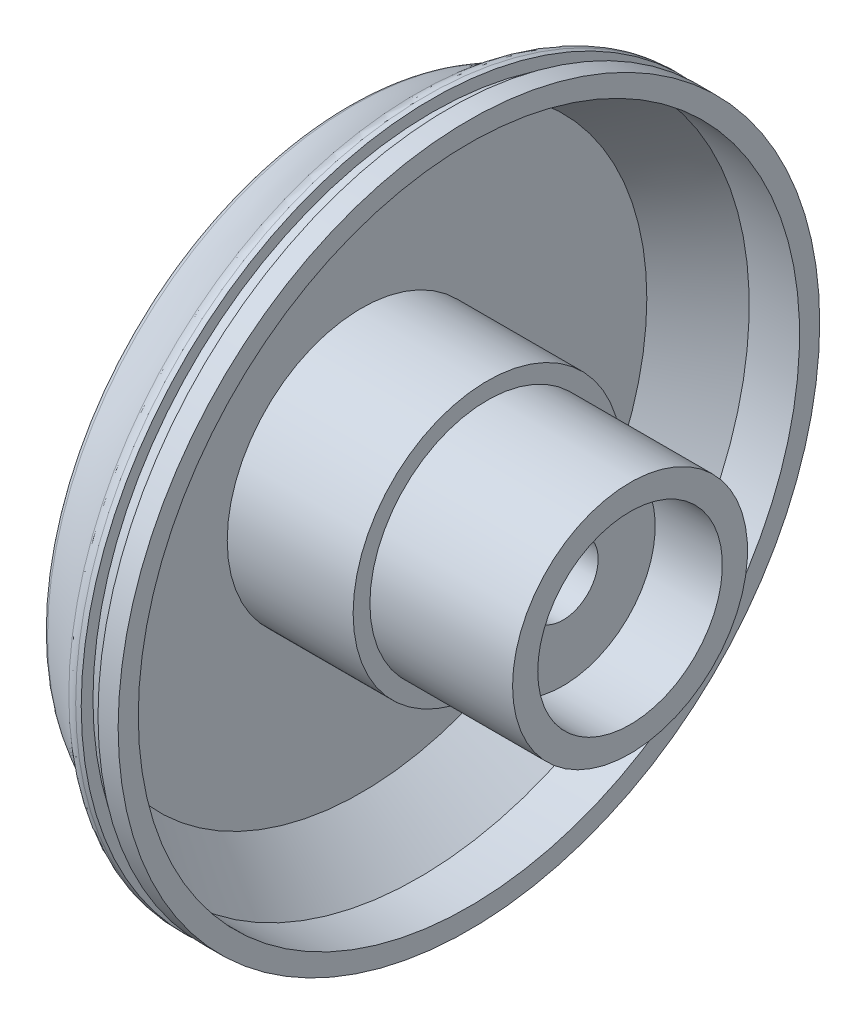
ISO-10303-21;
HEADER;
FILE_DESCRIPTION(('STEP AP214'),'2;1');
FILE_NAME('part.step','',(''),(''),'','','');
FILE_SCHEMA(('AUTOMOTIVE_DESIGN { 1 0 10303 214 1 1 1 1 }'));
ENDSEC;
DATA;
#1=APPLICATION_CONTEXT('core data for automotive mechanical design processes');
#2=APPLICATION_PROTOCOL_DEFINITION('international standard','automotive_design',2000,#1);
#3=PRODUCT_CONTEXT('',#1,'mechanical');
#4=PRODUCT('Part','Part','',(#3));
#5=PRODUCT_RELATED_PRODUCT_CATEGORY('part','',(#4));
#6=PRODUCT_DEFINITION_FORMATION('','',#4);
#7=PRODUCT_DEFINITION_CONTEXT('part definition',#1,'design');
#8=PRODUCT_DEFINITION('design','',#6,#7);
#9=PRODUCT_DEFINITION_SHAPE('','',#8);
#10=(LENGTH_UNIT() NAMED_UNIT(*) SI_UNIT(.MILLI.,.METRE.));
#11=(NAMED_UNIT(*) PLANE_ANGLE_UNIT() SI_UNIT($,.RADIAN.));
#12=(NAMED_UNIT(*) SI_UNIT($,.STERADIAN.) SOLID_ANGLE_UNIT());
#13=UNCERTAINTY_MEASURE_WITH_UNIT(LENGTH_MEASURE(1.E-05),#10,'distance_accuracy_value','');
#14=(GEOMETRIC_REPRESENTATION_CONTEXT(3) GLOBAL_UNCERTAINTY_ASSIGNED_CONTEXT((#13)) GLOBAL_UNIT_ASSIGNED_CONTEXT((#10,
#11,#12)) REPRESENTATION_CONTEXT('',''));
#15=CARTESIAN_POINT('',(0.,0.,0.));
#16=DIRECTION('',(0.,0.,1.));
#17=DIRECTION('',(1.,0.,0.));
#18=AXIS2_PLACEMENT_3D('',#15,#16,#17);
#19=CARTESIAN_POINT('',(170.,70.,0.));
#20=DIRECTION('',(-1.,0.,0.));
#21=DIRECTION('',(0.,0.,1.));
#22=AXIS2_PLACEMENT_3D('',#19,#20,#21);
#23=PLANE('',#22);
#24=CARTESIAN_POINT('',(170.,0.,0.));
#25=DIRECTION('',(-1.,0.,0.));
#26=DIRECTION('',(0.,0.,1.));
#27=AXIS2_PLACEMENT_3D('',#24,#25,#26);
#28=CIRCLE('',#27,70.);
#29=CARTESIAN_POINT('',(170.,0.,70.));
#30=VERTEX_POINT('',#29);
#31=EDGE_CURVE('E51',#30,#30,#28,.T.);
#32=ORIENTED_EDGE('',*,*,#31,.F.);
#33=EDGE_LOOP('',(#32));
#34=FACE_BOUND('',#33,.T.);
#35=CARTESIAN_POINT('',(170.,0.,0.));
#36=DIRECTION('',(-1.,0.,0.));
#37=DIRECTION('',(0.,0.,1.));
#38=AXIS2_PLACEMENT_3D('',#35,#36,#37);
#39=CIRCLE('',#38,55.);
#40=CARTESIAN_POINT('',(170.,0.,55.));
#41=VERTEX_POINT('',#40);
#42=EDGE_CURVE('E102',#41,#41,#39,.T.);
#43=ORIENTED_EDGE('',*,*,#42,.T.);
#44=EDGE_LOOP('',(#43));
#45=FACE_BOUND('',#44,.T.);
#46=ADVANCED_FACE('F31',(#34,#45),#23,.F.);
#47=CARTESIAN_POINT('',(0.,0.,0.));
#48=DIRECTION('',(-1.,0.,0.));
#49=DIRECTION('',(0.,0.,1.));
#50=AXIS2_PLACEMENT_3D('',#47,#48,#49);
#51=CYLINDRICAL_SURFACE('',#50,70.);
#52=CARTESIAN_POINT('',(85.,0.,0.));
#53=DIRECTION('',(-1.,0.,0.));
#54=DIRECTION('',(0.,0.,1.));
#55=AXIS2_PLACEMENT_3D('',#52,#53,#54);
#56=CIRCLE('',#55,70.);
#57=CARTESIAN_POINT('',(85.,0.,70.));
#58=VERTEX_POINT('',#57);
#59=EDGE_CURVE('E54',#58,#58,#56,.T.);
#60=ORIENTED_EDGE('',*,*,#59,.F.);
#61=EDGE_LOOP('',(#60));
#62=FACE_BOUND('',#61,.T.);
#63=ORIENTED_EDGE('',*,*,#31,.T.);
#64=EDGE_LOOP('',(#63));
#65=FACE_BOUND('',#64,.T.);
#66=ADVANCED_FACE('F149',(#62,#65),#51,.T.);
#67=CARTESIAN_POINT('',(85.,80.,0.));
#68=DIRECTION('',(-1.,0.,0.));
#69=DIRECTION('',(0.,0.,1.));
#70=AXIS2_PLACEMENT_3D('',#67,#68,#69);
#71=PLANE('',#70);
#72=CARTESIAN_POINT('',(85.,0.,0.));
#73=DIRECTION('',(-1.,0.,0.));
#74=DIRECTION('',(0.,0.,1.));
#75=AXIS2_PLACEMENT_3D('',#72,#73,#74);
#76=CIRCLE('',#75,80.);
#77=CARTESIAN_POINT('',(85.,0.,80.));
#78=VERTEX_POINT('',#77);
#79=EDGE_CURVE('E57',#78,#78,#76,.T.);
#80=ORIENTED_EDGE('',*,*,#79,.F.);
#81=EDGE_LOOP('',(#80));
#82=FACE_BOUND('',#81,.T.);
#83=ORIENTED_EDGE('',*,*,#59,.T.);
#84=EDGE_LOOP('',(#83));
#85=FACE_BOUND('',#84,.T.);
#86=ADVANCED_FACE('F155',(#82,#85),#71,.F.);
#87=CARTESIAN_POINT('',(0.,0.,0.));
#88=DIRECTION('',(-1.,0.,0.));
#89=DIRECTION('',(0.,0.,1.));
#90=AXIS2_PLACEMENT_3D('',#87,#88,#89);
#91=CYLINDRICAL_SURFACE('',#90,80.);
#92=CARTESIAN_POINT('',(10.,0.,0.));
#93=DIRECTION('',(-1.,0.,0.));
#94=DIRECTION('',(0.,0.,1.));
#95=AXIS2_PLACEMENT_3D('',#92,#93,#94);
#96=CIRCLE('',#95,80.);
#97=CARTESIAN_POINT('',(10.,0.,80.));
#98=VERTEX_POINT('',#97);
#99=EDGE_CURVE('E60',#98,#98,#96,.T.);
#100=ORIENTED_EDGE('',*,*,#99,.F.);
#101=EDGE_LOOP('',(#100));
#102=FACE_BOUND('',#101,.T.);
#103=ORIENTED_EDGE('',*,*,#79,.T.);
#104=EDGE_LOOP('',(#103));
#105=FACE_BOUND('',#104,.T.);
#106=ADVANCED_FACE('F305',(#102,#105),#91,.T.);
#107=CARTESIAN_POINT('',(10.,170.,0.));
#108=DIRECTION('',(-1.,0.,0.));
#109=DIRECTION('',(0.,0.,1.));
#110=AXIS2_PLACEMENT_3D('',#107,#108,#109);
#111=PLANE('',#110);
#112=CARTESIAN_POINT('',(9.99999999999999,0.,0.));
#113=DIRECTION('',(-1.,0.,0.));
#114=DIRECTION('',(0.,0.,1.));
#115=AXIS2_PLACEMENT_3D('',#112,#113,#114);
#116=CIRCLE('',#115,170.);
#117=CARTESIAN_POINT('',(9.99999999999999,0.,170.));
#118=VERTEX_POINT('',#117);
#119=EDGE_CURVE('E63',#118,#118,#116,.T.);
#120=ORIENTED_EDGE('',*,*,#119,.F.);
#121=EDGE_LOOP('',(#120));
#122=FACE_BOUND('',#121,.T.);
#123=ORIENTED_EDGE('',*,*,#99,.T.);
#124=EDGE_LOOP('',(#123));
#125=FACE_BOUND('',#124,.T.);
#126=ADVANCED_FACE('F295',(#122,#125),#111,.F.);
#127=CARTESIAN_POINT('',(9.99999999999999,0.,0.));
#128=DIRECTION('',(1.,0.,0.));
#129=DIRECTION('',(0.,0.,-1.));
#130=AXIS2_PLACEMENT_3D('',#127,#128,#129);
#131=CONICAL_SURFACE('',#130,170.,0.671143835436009);
#132=CARTESIAN_POINT('',(44.,0.,0.));
#133=DIRECTION('',(-1.,0.,0.));
#134=DIRECTION('',(0.,0.,1.));
#135=AXIS2_PLACEMENT_3D('',#132,#133,#134);
#136=CIRCLE('',#135,197.);
#137=CARTESIAN_POINT('',(44.,0.,197.));
#138=VERTEX_POINT('',#137);
#139=EDGE_CURVE('E66',#138,#138,#136,.T.);
#140=ORIENTED_EDGE('',*,*,#139,.F.);
#141=EDGE_LOOP('',(#140));
#142=FACE_BOUND('',#141,.T.);
#143=ORIENTED_EDGE('',*,*,#119,.T.);
#144=EDGE_LOOP('',(#143));
#145=FACE_BOUND('',#144,.T.);
#146=ADVANCED_FACE('F285',(#142,#145),#131,.F.);
#147=CARTESIAN_POINT('',(0.,0.,0.));
#148=DIRECTION('',(-1.,0.,0.));
#149=DIRECTION('',(0.,0.,1.));
#150=AXIS2_PLACEMENT_3D('',#147,#148,#149);
#151=CYLINDRICAL_SURFACE('',#150,197.);
#152=CARTESIAN_POINT('',(74.,0.,0.));
#153=DIRECTION('',(-1.,0.,0.));
#154=DIRECTION('',(0.,0.,1.));
#155=AXIS2_PLACEMENT_3D('',#152,#153,#154);
#156=CIRCLE('',#155,197.);
#157=CARTESIAN_POINT('',(74.,0.,197.));
#158=VERTEX_POINT('',#157);
#159=EDGE_CURVE('E69',#158,#158,#156,.T.);
#160=ORIENTED_EDGE('',*,*,#159,.F.);
#161=EDGE_LOOP('',(#160));
#162=FACE_BOUND('',#161,.T.);
#163=ORIENTED_EDGE('',*,*,#139,.T.);
#164=EDGE_LOOP('',(#163));
#165=FACE_BOUND('',#164,.T.);
#166=ADVANCED_FACE('F275',(#162,#165),#151,.F.);
#167=CARTESIAN_POINT('',(74.,209.,0.));
#168=DIRECTION('',(-1.,0.,0.));
#169=DIRECTION('',(0.,0.,1.));
#170=AXIS2_PLACEMENT_3D('',#167,#168,#169);
#171=PLANE('',#170);
#172=CARTESIAN_POINT('',(74.,0.,0.));
#173=DIRECTION('',(-1.,0.,0.));
#174=DIRECTION('',(0.,0.,1.));
#175=AXIS2_PLACEMENT_3D('',#172,#173,#174);
#176=CIRCLE('',#175,209.);
#177=CARTESIAN_POINT('',(74.,0.,209.));
#178=VERTEX_POINT('',#177);
#179=EDGE_CURVE('E72',#178,#178,#176,.T.);
#180=ORIENTED_EDGE('',*,*,#179,.F.);
#181=EDGE_LOOP('',(#180));
#182=FACE_BOUND('',#181,.T.);
#183=ORIENTED_EDGE('',*,*,#159,.T.);
#184=EDGE_LOOP('',(#183));
#185=FACE_BOUND('',#184,.T.);
#186=ADVANCED_FACE('F265',(#182,#185),#171,.F.);
#187=CARTESIAN_POINT('',(0.,0.,0.));
#188=DIRECTION('',(-1.,0.,0.));
#189=DIRECTION('',(0.,0.,1.));
#190=AXIS2_PLACEMENT_3D('',#187,#188,#189);
#191=CYLINDRICAL_SURFACE('',#190,209.);
#192=CARTESIAN_POINT('',(62.,0.,0.));
#193=DIRECTION('',(-1.,0.,0.));
#194=DIRECTION('',(0.,0.,1.));
#195=AXIS2_PLACEMENT_3D('',#192,#193,#194);
#196=CIRCLE('',#195,209.);
#197=CARTESIAN_POINT('',(62.,0.,209.));
#198=VERTEX_POINT('',#197);
#199=EDGE_CURVE('E75',#198,#198,#196,.T.);
#200=ORIENTED_EDGE('',*,*,#199,.F.);
#201=EDGE_LOOP('',(#200));
#202=FACE_BOUND('',#201,.T.);
#203=ORIENTED_EDGE('',*,*,#179,.T.);
#204=EDGE_LOOP('',(#203));
#205=FACE_BOUND('',#204,.T.);
#206=ADVANCED_FACE('F255',(#202,#205),#191,.T.);
#207=CARTESIAN_POINT('',(62.,209.,0.));
#208=DIRECTION('',(1.,0.,0.));
#209=DIRECTION('',(0.,0.,-1.));
#210=AXIS2_PLACEMENT_3D('',#207,#208,#209);
#211=PLANE('',#210);
#212=CARTESIAN_POINT('',(62.,0.,0.));
#213=DIRECTION('',(-1.,0.,0.));
#214=DIRECTION('',(0.,0.,1.));
#215=AXIS2_PLACEMENT_3D('',#212,#213,#214);
#216=CIRCLE('',#215,202.);
#217=CARTESIAN_POINT('',(62.,0.,202.));
#218=VERTEX_POINT('',#217);
#219=EDGE_CURVE('E78',#218,#218,#216,.T.);
#220=ORIENTED_EDGE('',*,*,#219,.F.);
#221=EDGE_LOOP('',(#220));
#222=FACE_BOUND('',#221,.T.);
#223=ORIENTED_EDGE('',*,*,#199,.T.);
#224=EDGE_LOOP('',(#223));
#225=FACE_BOUND('',#224,.T.);
#226=ADVANCED_FACE('F245',(#222,#225),#211,.F.);
#227=CARTESIAN_POINT('',(0.,0.,0.));
#228=DIRECTION('',(-1.,0.,0.));
#229=DIRECTION('',(0.,0.,1.));
#230=AXIS2_PLACEMENT_3D('',#227,#228,#229);
#231=CYLINDRICAL_SURFACE('',#230,202.);
#232=CARTESIAN_POINT('',(52.,0.,0.));
#233=DIRECTION('',(-1.,0.,0.));
#234=DIRECTION('',(0.,0.,1.));
#235=AXIS2_PLACEMENT_3D('',#232,#233,#234);
#236=CIRCLE('',#235,202.);
#237=CARTESIAN_POINT('',(52.,0.,202.));
#238=VERTEX_POINT('',#237);
#239=EDGE_CURVE('E81',#238,#238,#236,.T.);
#240=ORIENTED_EDGE('',*,*,#239,.F.);
#241=EDGE_LOOP('',(#240));
#242=FACE_BOUND('',#241,.T.);
#243=ORIENTED_EDGE('',*,*,#219,.T.);
#244=EDGE_LOOP('',(#243));
#245=FACE_BOUND('',#244,.T.);
#246=ADVANCED_FACE('F235',(#242,#245),#231,.T.);
#247=CARTESIAN_POINT('',(52.,209.,0.));
#248=DIRECTION('',(-1.,0.,0.));
#249=DIRECTION('',(0.,0.,1.));
#250=AXIS2_PLACEMENT_3D('',#247,#248,#249);
#251=PLANE('',#250);
#252=CARTESIAN_POINT('',(52.,0.,0.));
#253=DIRECTION('',(-1.,0.,0.));
#254=DIRECTION('',(0.,0.,1.));
#255=AXIS2_PLACEMENT_3D('',#252,#253,#254);
#256=CIRCLE('',#255,209.);
#257=CARTESIAN_POINT('',(52.,0.,209.));
#258=VERTEX_POINT('',#257);
#259=EDGE_CURVE('E84',#258,#258,#256,.T.);
#260=ORIENTED_EDGE('',*,*,#259,.F.);
#261=EDGE_LOOP('',(#260));
#262=FACE_BOUND('',#261,.T.);
#263=ORIENTED_EDGE('',*,*,#239,.T.);
#264=EDGE_LOOP('',(#263));
#265=FACE_BOUND('',#264,.T.);
#266=ADVANCED_FACE('F198',(#262,#265),#251,.F.);
#267=CARTESIAN_POINT('',(0.,0.,0.));
#268=DIRECTION('',(-1.,0.,0.));
#269=DIRECTION('',(0.,0.,1.));
#270=AXIS2_PLACEMENT_3D('',#267,#268,#269);
#271=CYLINDRICAL_SURFACE('',#270,209.);
#272=CARTESIAN_POINT('',(48.7054664370741,0.,0.));
#273=DIRECTION('',(1.,0.,0.));
#274=DIRECTION('',(0.,0.,-1.));
#275=AXIS2_PLACEMENT_3D('',#272,#273,#274);
#276=CIRCLE('',#275,209.);
#277=CARTESIAN_POINT('',(48.7054664370741,0.,-209.));
#278=VERTEX_POINT('',#277);
#279=EDGE_CURVE('E38',#278,#278,#276,.T.);
#280=ORIENTED_EDGE('',*,*,#279,.T.);
#281=EDGE_LOOP('',(#280));
#282=FACE_BOUND('',#281,.T.);
#283=ORIENTED_EDGE('',*,*,#259,.T.);
#284=EDGE_LOOP('',(#283));
#285=FACE_BOUND('',#284,.T.);
#286=ADVANCED_FACE('F145',(#282,#285),#271,.T.);
#287=CARTESIAN_POINT('',(-75.236582293902,0.,0.));
#288=DIRECTION('',(-1.,0.,0.));
#289=DIRECTION('',(0.,0.,1.));
#290=AXIS2_PLACEMENT_3D('',#287,#288,#289);
#291=TOROIDAL_SURFACE('',#290,346.160213904331,182.4);
#292=CARTESIAN_POINT('',(42.2635720123871,0.,0.));
#293=DIRECTION('',(-1.,0.,0.));
#294=DIRECTION('',(0.,0.,1.));
#295=AXIS2_PLACEMENT_3D('',#292,#293,#294);
#296=CIRCLE('',#295,206.648659766337);
#297=CARTESIAN_POINT('',(42.2635720123871,0.,206.648659766337));
#298=VERTEX_POINT('',#297);
#299=EDGE_CURVE('E42',#298,#298,#296,.T.);
#300=ORIENTED_EDGE('',*,*,#299,.T.);
#301=EDGE_LOOP('',(#300));
#302=FACE_BOUND('',#301,.T.);
#303=CARTESIAN_POINT('',(5.56982420509868,0.,0.));
#304=DIRECTION('',(-1.,0.,0.));
#305=DIRECTION('',(0.,0.,1.));
#306=AXIS2_PLACEMENT_3D('',#303,#304,#305);
#307=CIRCLE('',#306,182.636256428008);
#308=CARTESIAN_POINT('',(5.56982420509868,0.,182.636256428008));
#309=VERTEX_POINT('',#308);
#310=EDGE_CURVE('E46',#309,#309,#307,.F.);
#311=ORIENTED_EDGE('',*,*,#310,.T.);
#312=EDGE_LOOP('',(#311));
#313=FACE_BOUND('',#312,.T.);
#314=ADVANCED_FACE('F140',(#302,#313),#291,.F.);
#315=CARTESIAN_POINT('',(0.,55.,0.));
#316=DIRECTION('',(1.,0.,0.));
#317=DIRECTION('',(0.,0.,-1.));
#318=AXIS2_PLACEMENT_3D('',#315,#316,#317);
#319=PLANE('',#318);
#320=CARTESIAN_POINT('',(0.,0.,0.));
#321=DIRECTION('',(1.,0.,0.));
#322=DIRECTION('',(0.,0.,-1.));
#323=AXIS2_PLACEMENT_3D('',#320,#321,#322);
#324=CIRCLE('',#323,173.671127180402);
#325=CARTESIAN_POINT('',(0.,0.,-173.671127180402));
#326=VERTEX_POINT('',#325);
#327=EDGE_CURVE('E10',#326,#326,#324,.F.);
#328=ORIENTED_EDGE('',*,*,#327,.T.);
#329=EDGE_LOOP('',(#328));
#330=FACE_BOUND('',#329,.T.);
#331=CARTESIAN_POINT('',(0.,0.,0.));
#332=DIRECTION('',(-1.,0.,0.));
#333=DIRECTION('',(0.,0.,1.));
#334=AXIS2_PLACEMENT_3D('',#331,#332,#333);
#335=CIRCLE('',#334,55.);
#336=CARTESIAN_POINT('',(0.,0.,55.));
#337=VERTEX_POINT('',#336);
#338=EDGE_CURVE('E87',#337,#337,#335,.T.);
#339=ORIENTED_EDGE('',*,*,#338,.F.);
#340=EDGE_LOOP('',(#339));
#341=FACE_BOUND('',#340,.T.);
#342=ADVANCED_FACE('F135',(#330,#341),#319,.F.);
#343=CARTESIAN_POINT('',(0.,0.,0.));
#344=DIRECTION('',(-1.,0.,0.));
#345=DIRECTION('',(0.,0.,1.));
#346=AXIS2_PLACEMENT_3D('',#343,#344,#345);
#347=CYLINDRICAL_SURFACE('',#346,55.);
#348=CARTESIAN_POINT('',(40.,0.,0.));
#349=DIRECTION('',(-1.,0.,0.));
#350=DIRECTION('',(0.,0.,1.));
#351=AXIS2_PLACEMENT_3D('',#348,#349,#350);
#352=CIRCLE('',#351,55.);
#353=CARTESIAN_POINT('',(40.,0.,55.));
#354=VERTEX_POINT('',#353);
#355=EDGE_CURVE('E90',#354,#354,#352,.T.);
#356=ORIENTED_EDGE('',*,*,#355,.F.);
#357=EDGE_LOOP('',(#356));
#358=FACE_BOUND('',#357,.T.);
#359=ORIENTED_EDGE('',*,*,#338,.T.);
#360=EDGE_LOOP('',(#359));
#361=FACE_BOUND('',#360,.T.);
#362=ADVANCED_FACE('F129',(#358,#361),#347,.F.);
#363=CARTESIAN_POINT('',(40.,21.0099939118683,0.));
#364=DIRECTION('',(1.,0.,0.));
#365=DIRECTION('',(0.,0.,-1.));
#366=AXIS2_PLACEMENT_3D('',#363,#364,#365);
#367=PLANE('',#366);
#368=CARTESIAN_POINT('',(40.,0.,0.));
#369=DIRECTION('',(-1.,0.,0.));
#370=DIRECTION('',(0.,0.,1.));
#371=AXIS2_PLACEMENT_3D('',#368,#369,#370);
#372=CIRCLE('',#371,21.0099939118683);
#373=CARTESIAN_POINT('',(40.,0.,21.0099939118683));
#374=VERTEX_POINT('',#373);
#375=EDGE_CURVE('E93',#374,#374,#372,.T.);
#376=ORIENTED_EDGE('',*,*,#375,.F.);
#377=EDGE_LOOP('',(#376));
#378=FACE_BOUND('',#377,.T.);
#379=ORIENTED_EDGE('',*,*,#355,.T.);
#380=EDGE_LOOP('',(#379));
#381=FACE_BOUND('',#380,.T.);
#382=ADVANCED_FACE('F123',(#378,#381),#367,.F.);
#383=CARTESIAN_POINT('',(0.,0.,0.));
#384=DIRECTION('',(-1.,0.,0.));
#385=DIRECTION('',(0.,0.,1.));
#386=AXIS2_PLACEMENT_3D('',#383,#384,#385);
#387=CYLINDRICAL_SURFACE('',#386,21.0099939118683);
#388=CARTESIAN_POINT('',(130.,0.,0.));
#389=DIRECTION('',(-1.,0.,0.));
#390=DIRECTION('',(0.,0.,1.));
#391=AXIS2_PLACEMENT_3D('',#388,#389,#390);
#392=CIRCLE('',#391,21.0099939118684);
#393=CARTESIAN_POINT('',(130.,0.,21.0099939118684));
#394=VERTEX_POINT('',#393);
#395=EDGE_CURVE('E96',#394,#394,#392,.T.);
#396=ORIENTED_EDGE('',*,*,#395,.F.);
#397=EDGE_LOOP('',(#396));
#398=FACE_BOUND('',#397,.T.);
#399=ORIENTED_EDGE('',*,*,#375,.T.);
#400=EDGE_LOOP('',(#399));
#401=FACE_BOUND('',#400,.T.);
#402=ADVANCED_FACE('F117',(#398,#401),#387,.F.);
#403=CARTESIAN_POINT('',(130.,55.,0.));
#404=DIRECTION('',(-1.,0.,0.));
#405=DIRECTION('',(0.,0.,1.));
#406=AXIS2_PLACEMENT_3D('',#403,#404,#405);
#407=PLANE('',#406);
#408=CARTESIAN_POINT('',(130.,0.,0.));
#409=DIRECTION('',(-1.,0.,0.));
#410=DIRECTION('',(0.,0.,1.));
#411=AXIS2_PLACEMENT_3D('',#408,#409,#410);
#412=CIRCLE('',#411,55.);
#413=CARTESIAN_POINT('',(130.,0.,55.));
#414=VERTEX_POINT('',#413);
#415=EDGE_CURVE('E99',#414,#414,#412,.T.);
#416=ORIENTED_EDGE('',*,*,#415,.F.);
#417=EDGE_LOOP('',(#416));
#418=FACE_BOUND('',#417,.T.);
#419=ORIENTED_EDGE('',*,*,#395,.T.);
#420=EDGE_LOOP('',(#419));
#421=FACE_BOUND('',#420,.T.);
#422=ADVANCED_FACE('F111',(#418,#421),#407,.F.);
#423=CARTESIAN_POINT('',(0.,0.,0.));
#424=DIRECTION('',(-1.,0.,0.));
#425=DIRECTION('',(0.,0.,1.));
#426=AXIS2_PLACEMENT_3D('',#423,#424,#425);
#427=CYLINDRICAL_SURFACE('',#426,55.);
#428=ORIENTED_EDGE('',*,*,#42,.F.);
#429=EDGE_LOOP('',(#428));
#430=FACE_BOUND('',#429,.T.);
#431=ORIENTED_EDGE('',*,*,#415,.T.);
#432=EDGE_LOOP('',(#431));
#433=FACE_BOUND('',#432,.T.);
#434=ADVANCED_FACE('F107',(#430,#433),#427,.F.);
#435=CARTESIAN_POINT('',(48.7054664370741,0.,0.));
#436=DIRECTION('',(1.,0.,0.));
#437=DIRECTION('',(0.,0.,-1.));
#438=AXIS2_PLACEMENT_3D('',#435,#436,#437);
#439=TOROIDAL_SURFACE('',#438,199.,10.);
#440=ORIENTED_EDGE('',*,*,#279,.F.);
#441=EDGE_LOOP('',(#440));
#442=FACE_BOUND('',#441,.T.);
#443=ORIENTED_EDGE('',*,*,#299,.F.);
#444=EDGE_LOOP('',(#443));
#445=FACE_BOUND('',#444,.T.);
#446=ADVANCED_FACE('F110',(#442,#445),#439,.T.);
#447=CARTESIAN_POINT('',(10.,0.,0.));
#448=DIRECTION('',(-1.,0.,0.));
#449=DIRECTION('',(0.,0.,1.));
#450=AXIS2_PLACEMENT_3D('',#447,#448,#449);
#451=TOROIDAL_SURFACE('',#450,173.671127180402,10.);
#452=ORIENTED_EDGE('',*,*,#310,.F.);
#453=EDGE_LOOP('',(#452));
#454=FACE_BOUND('',#453,.T.);
#455=ORIENTED_EDGE('',*,*,#327,.F.);
#456=EDGE_LOOP('',(#455));
#457=FACE_BOUND('',#456,.T.);
#458=ADVANCED_FACE('F33',(#454,#457),#451,.T.);
#459=CLOSED_SHELL('',(#46,#66,#86,#106,#126,#146,#166,#186,#206,#226,#246,#266,#286,#314,#342,
#362,#382,#402,#422,#434,#446,#458));
#460=MANIFOLD_SOLID_BREP('B2',#459);
#461=ADVANCED_BREP_SHAPE_REPRESENTATION('',(#18,#460),#14);
#462=SHAPE_DEFINITION_REPRESENTATION(#9,#461);
ENDSEC;
END-ISO-10303-21;
